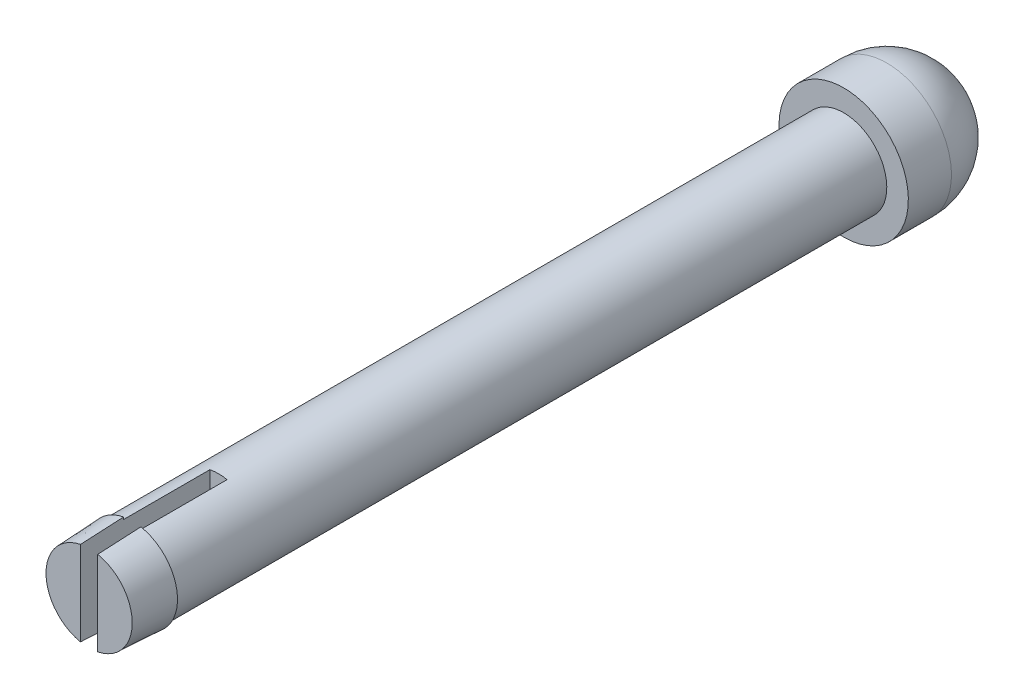
ISO-10303-21;
HEADER;
FILE_DESCRIPTION(('STEP AP214'),'2;1');
FILE_NAME('part.step','',(''),(''),'','','');
FILE_SCHEMA(('AUTOMOTIVE_DESIGN { 1 0 10303 214 1 1 1 1 }'));
ENDSEC;
DATA;
#1=APPLICATION_CONTEXT('core data for automotive mechanical design processes');
#2=APPLICATION_PROTOCOL_DEFINITION('international standard','automotive_design',2000,#1);
#3=PRODUCT_CONTEXT('',#1,'mechanical');
#4=PRODUCT('Part','Part','',(#3));
#5=PRODUCT_RELATED_PRODUCT_CATEGORY('part','',(#4));
#6=PRODUCT_DEFINITION_FORMATION('','',#4);
#7=PRODUCT_DEFINITION_CONTEXT('part definition',#1,'design');
#8=PRODUCT_DEFINITION('design','',#6,#7);
#9=PRODUCT_DEFINITION_SHAPE('','',#8);
#10=(LENGTH_UNIT() NAMED_UNIT(*) SI_UNIT(.MILLI.,.METRE.));
#11=(NAMED_UNIT(*) PLANE_ANGLE_UNIT() SI_UNIT($,.RADIAN.));
#12=(NAMED_UNIT(*) SI_UNIT($,.STERADIAN.) SOLID_ANGLE_UNIT());
#13=UNCERTAINTY_MEASURE_WITH_UNIT(LENGTH_MEASURE(1.E-05),#10,'distance_accuracy_value','');
#14=(GEOMETRIC_REPRESENTATION_CONTEXT(3) GLOBAL_UNCERTAINTY_ASSIGNED_CONTEXT((#13)) GLOBAL_UNIT_ASSIGNED_CONTEXT((#10,
#11,#12)) REPRESENTATION_CONTEXT('',''));
#15=CARTESIAN_POINT('',(0.,0.,0.));
#16=DIRECTION('',(0.,0.,1.));
#17=DIRECTION('',(1.,0.,0.));
#18=AXIS2_PLACEMENT_3D('',#15,#16,#17);
#19=CARTESIAN_POINT('',(0.,0.,-2.));
#20=DIRECTION('',(0.,0.,-1.));
#21=DIRECTION('',(0.,1.,0.));
#22=AXIS2_PLACEMENT_3D('',#19,#20,#21);
#23=CONICAL_SURFACE('',#22,2.1,0.0499583957219431);
#24=CARTESIAN_POINT('',(-0.4,-1.83335675770293,2.47029442686772));
#25=CARTESIAN_POINT('',(-0.4,-1.90062712184205,1.15527599281112));
#26=CARTESIAN_POINT('',(-0.4,-1.96777342505117,-0.159748764169583));
#27=CARTESIAN_POINT('',(-0.4,-2.10181790949153,-2.78981092166637));
#28=CARTESIAN_POINT('',(-0.4,-2.16871609072321,-4.10484832218244));
#29=CARTESIAN_POINT('',(-0.4,-2.23549021102532,-5.41989204562258));
#30=B_SPLINE_CURVE_WITH_KNOTS('',3,(#24,#25,#26,#27,#28,#29),.UNSPECIFIED.,.F.,.F.,(4,2,4),(0.,
3.95021374580684,7.90042748466622),.UNSPECIFIED.);
#31=CARTESIAN_POINT('',(-0.4,-1.95959179422654,0.));
#32=VERTEX_POINT('',#31);
#33=CARTESIAN_POINT('',(-0.4,-2.06155281280883,-2.));
#34=VERTEX_POINT('',#33);
#35=EDGE_CURVE('E193',#32,#34,#30,.T.);
#36=ORIENTED_EDGE('',*,*,#35,.F.);
#37=CARTESIAN_POINT('',(0.,0.,0.));
#38=DIRECTION('',(0.,0.,-1.));
#39=DIRECTION('',(0.,1.,0.));
#40=AXIS2_PLACEMENT_3D('',#37,#38,#39);
#41=CIRCLE('',#40,2.);
#42=CARTESIAN_POINT('',(-0.4,1.95959179422654,0.));
#43=VERTEX_POINT('',#42);
#44=EDGE_CURVE('E118',#32,#43,#41,.T.);
#45=ORIENTED_EDGE('',*,*,#44,.T.);
#46=CARTESIAN_POINT('',(-0.4,2.23549021102532,-5.41989204562258));
#47=CARTESIAN_POINT('',(-0.4,2.16871609072321,-4.10484832218244));
#48=CARTESIAN_POINT('',(-0.4,2.10181790949153,-2.78981092166637));
#49=CARTESIAN_POINT('',(-0.4,1.96777342505117,-0.159748764169584));
#50=CARTESIAN_POINT('',(-0.4,1.90062712184205,1.15527599281112));
#51=CARTESIAN_POINT('',(-0.4,1.83335675770293,2.47029442686772));
#52=B_SPLINE_CURVE_WITH_KNOTS('',3,(#46,#47,#48,#49,#50,#51),.UNSPECIFIED.,.F.,.F.,(4,2,4),(0.,
3.95021373885938,7.90042748466622),.UNSPECIFIED.);
#53=CARTESIAN_POINT('',(-0.4,2.06155281280883,-2.));
#54=VERTEX_POINT('',#53);
#55=EDGE_CURVE('E188',#54,#43,#52,.T.);
#56=ORIENTED_EDGE('',*,*,#55,.F.);
#57=CARTESIAN_POINT('',(0.,0.,-2.));
#58=DIRECTION('',(0.,0.,-1.));
#59=DIRECTION('',(0.,1.,0.));
#60=AXIS2_PLACEMENT_3D('',#57,#58,#59);
#61=CIRCLE('',#60,2.1);
#62=EDGE_CURVE('E117',#34,#54,#61,.T.);
#63=ORIENTED_EDGE('',*,*,#62,.F.);
#64=EDGE_LOOP('',(#36,#45,#56,#63));
#65=FACE_BOUND('',#64,.T.);
#66=ADVANCED_FACE('F34',(#65),#23,.T.);
#67=CARTESIAN_POINT('',(0.,2.1,-2.));
#68=DIRECTION('',(0.,0.,-1.));
#69=DIRECTION('',(0.,1.,0.));
#70=AXIS2_PLACEMENT_3D('',#67,#68,#69);
#71=PLANE('',#70);
#72=DIRECTION('',(0.,1.,0.));
#73=VECTOR('',#72,1.);
#74=CARTESIAN_POINT('',(-0.4,2.1,-2.));
#75=LINE('',#74,#73);
#76=CARTESIAN_POINT('',(-0.4,-1.95959179422654,-2.));
#77=VERTEX_POINT('',#76);
#78=EDGE_CURVE('E57',#34,#77,#75,.T.);
#79=ORIENTED_EDGE('',*,*,#78,.F.);
#80=ORIENTED_EDGE('',*,*,#62,.T.);
#81=CARTESIAN_POINT('',(-0.4,1.95959179422654,-2.));
#82=VERTEX_POINT('',#81);
#83=EDGE_CURVE('E186',#82,#54,#75,.T.);
#84=ORIENTED_EDGE('',*,*,#83,.F.);
#85=CARTESIAN_POINT('',(0.,0.,-2.));
#86=DIRECTION('',(0.,0.,-1.));
#87=DIRECTION('',(0.,1.,0.));
#88=AXIS2_PLACEMENT_3D('',#85,#86,#87);
#89=CIRCLE('',#88,2.);
#90=EDGE_CURVE('E105',#82,#77,#89,.F.);
#91=ORIENTED_EDGE('',*,*,#90,.T.);
#92=EDGE_LOOP('',(#79,#80,#84,#91));
#93=FACE_BOUND('',#92,.T.);
#94=ADVANCED_FACE('F201',(#93),#71,.T.);
#95=CARTESIAN_POINT('',(0.,0.,0.));
#96=DIRECTION('',(0.,0.,1.));
#97=DIRECTION('',(1.,0.,0.));
#98=AXIS2_PLACEMENT_3D('',#95,#96,#97);
#99=PLANE('',#98);
#100=DIRECTION('',(0.,-1.,0.));
#101=VECTOR('',#100,1.);
#102=CARTESIAN_POINT('',(-0.4,0.,0.));
#103=LINE('',#102,#101);
#104=EDGE_CURVE('E104',#43,#32,#103,.T.);
#105=ORIENTED_EDGE('',*,*,#104,.F.);
#106=ORIENTED_EDGE('',*,*,#44,.F.);
#107=EDGE_LOOP('',(#105,#106));
#108=FACE_BOUND('',#107,.T.);
#109=ADVANCED_FACE('F204',(#108),#99,.T.);
#110=CARTESIAN_POINT('',(0.,0.,-36.));
#111=DIRECTION('',(0.,0.,1.));
#112=DIRECTION('',(1.,0.,0.));
#113=AXIS2_PLACEMENT_3D('',#110,#111,#112);
#114=CYLINDRICAL_SURFACE('',#113,2.);
#115=DIRECTION('',(0.,0.,1.));
#116=VECTOR('',#115,1.);
#117=CARTESIAN_POINT('',(-0.4,-1.95959179422654,-36.));
#118=LINE('',#117,#116);
#119=CARTESIAN_POINT('',(-0.4,-1.95959179422654,-6.));
#120=VERTEX_POINT('',#119);
#121=EDGE_CURVE('E123',#77,#120,#118,.F.);
#122=ORIENTED_EDGE('',*,*,#121,.F.);
#123=ORIENTED_EDGE('',*,*,#90,.F.);
#124=DIRECTION('',(0.,0.,1.));
#125=VECTOR('',#124,1.);
#126=CARTESIAN_POINT('',(-0.4,1.95959179422654,-36.));
#127=LINE('',#126,#125);
#128=CARTESIAN_POINT('',(-0.4,1.95959179422654,-6.));
#129=VERTEX_POINT('',#128);
#130=EDGE_CURVE('E148',#129,#82,#127,.T.);
#131=ORIENTED_EDGE('',*,*,#130,.F.);
#132=CARTESIAN_POINT('',(0.,0.,-6.));
#133=DIRECTION('',(0.,0.,1.));
#134=DIRECTION('',(1.,0.,0.));
#135=AXIS2_PLACEMENT_3D('',#132,#133,#134);
#136=CIRCLE('',#135,2.);
#137=CARTESIAN_POINT('',(0.4,1.95959179422654,-6.));
#138=VERTEX_POINT('',#137);
#139=EDGE_CURVE('E38',#129,#138,#136,.F.);
#140=ORIENTED_EDGE('',*,*,#139,.T.);
#141=DIRECTION('',(0.,0.,1.));
#142=VECTOR('',#141,1.);
#143=CARTESIAN_POINT('',(0.4,1.95959179422654,-36.));
#144=LINE('',#143,#142);
#145=CARTESIAN_POINT('',(0.4,1.95959179422654,-2.));
#146=VERTEX_POINT('',#145);
#147=EDGE_CURVE('E113',#146,#138,#144,.F.);
#148=ORIENTED_EDGE('',*,*,#147,.F.);
#149=CARTESIAN_POINT('',(0.4,-1.95959179422654,-2.));
#150=VERTEX_POINT('',#149);
#151=EDGE_CURVE('E136',#150,#146,#89,.F.);
#152=ORIENTED_EDGE('',*,*,#151,.F.);
#153=DIRECTION('',(0.,0.,1.));
#154=VECTOR('',#153,1.);
#155=CARTESIAN_POINT('',(0.4,-1.95959179422654,-36.));
#156=LINE('',#155,#154);
#157=CARTESIAN_POINT('',(0.4,-1.95959179422654,-6.));
#158=VERTEX_POINT('',#157);
#159=EDGE_CURVE('E170',#158,#150,#156,.T.);
#160=ORIENTED_EDGE('',*,*,#159,.F.);
#161=EDGE_CURVE('E11',#158,#120,#136,.F.);
#162=ORIENTED_EDGE('',*,*,#161,.T.);
#163=EDGE_LOOP('',(#122,#123,#131,#140,#148,#152,#160,#162));
#164=FACE_BOUND('',#163,.T.);
#165=CARTESIAN_POINT('',(0.,0.,-35.));
#166=DIRECTION('',(0.,0.,1.));
#167=DIRECTION('',(0.,-1.,0.));
#168=AXIS2_PLACEMENT_3D('',#165,#166,#167);
#169=CIRCLE('',#168,2.);
#170=CARTESIAN_POINT('',(0.,-2.,-35.));
#171=VERTEX_POINT('',#170);
#172=EDGE_CURVE('E133',#171,#171,#169,.F.);
#173=ORIENTED_EDGE('',*,*,#172,.F.);
#174=EDGE_LOOP('',(#173));
#175=FACE_BOUND('',#174,.T.);
#176=ADVANCED_FACE('F36',(#164,#175),#114,.T.);
#177=CARTESIAN_POINT('',(0.,-3.,-35.));
#178=DIRECTION('',(0.,0.,1.));
#179=DIRECTION('',(0.,-1.,0.));
#180=AXIS2_PLACEMENT_3D('',#177,#178,#179);
#181=PLANE('',#180);
#182=ORIENTED_EDGE('',*,*,#172,.T.);
#183=EDGE_LOOP('',(#182));
#184=FACE_BOUND('',#183,.T.);
#185=CARTESIAN_POINT('',(0.,0.,-35.));
#186=DIRECTION('',(0.,0.,1.));
#187=DIRECTION('',(0.,-1.,0.));
#188=AXIS2_PLACEMENT_3D('',#185,#186,#187);
#189=CIRCLE('',#188,3.);
#190=CARTESIAN_POINT('',(0.,-3.,-35.));
#191=VERTEX_POINT('',#190);
#192=EDGE_CURVE('E130',#191,#191,#189,.T.);
#193=ORIENTED_EDGE('',*,*,#192,.T.);
#194=EDGE_LOOP('',(#193));
#195=FACE_BOUND('',#194,.T.);
#196=ADVANCED_FACE('F210',(#184,#195),#181,.T.);
#197=CARTESIAN_POINT('',(0.,0.,-35.));
#198=DIRECTION('',(0.,0.,1.));
#199=DIRECTION('',(0.,-1.,0.));
#200=AXIS2_PLACEMENT_3D('',#197,#198,#199);
#201=CYLINDRICAL_SURFACE('',#200,3.);
#202=CARTESIAN_POINT('',(0.,0.,-37.));
#203=DIRECTION('',(0.,0.,1.));
#204=DIRECTION('',(0.,-1.,0.));
#205=AXIS2_PLACEMENT_3D('',#202,#203,#204);
#206=CIRCLE('',#205,3.);
#207=CARTESIAN_POINT('',(0.,-3.,-37.));
#208=VERTEX_POINT('',#207);
#209=EDGE_CURVE('E127',#208,#208,#206,.T.);
#210=ORIENTED_EDGE('',*,*,#209,.T.);
#211=EDGE_LOOP('',(#210));
#212=FACE_BOUND('',#211,.T.);
#213=ORIENTED_EDGE('',*,*,#192,.F.);
#214=EDGE_LOOP('',(#213));
#215=FACE_BOUND('',#214,.T.);
#216=ADVANCED_FACE('F223',(#212,#215),#201,.T.);
#217=CARTESIAN_POINT('',(0.,0.,-37.));
#218=DIRECTION('',(0.,0.,1.));
#219=DIRECTION('',(0.,-1.,0.));
#220=AXIS2_PLACEMENT_3D('',#217,#218,#219);
#221=SPHERICAL_SURFACE('',#220,3.);
#222=ORIENTED_EDGE('',*,*,#209,.F.);
#223=EDGE_LOOP('',(#222));
#224=FACE_BOUND('',#223,.T.);
#225=ADVANCED_FACE('F217',(#224),#221,.T.);
#226=CARTESIAN_POINT('',(0.4,-2.23549021102532,-5.41989204562258));
#227=CARTESIAN_POINT('',(0.4,-2.16871609072321,-4.10484832218244));
#228=CARTESIAN_POINT('',(0.4,-2.10181790949153,-2.78981092166637));
#229=CARTESIAN_POINT('',(0.4,-1.96777342505117,-0.159748764169584));
#230=CARTESIAN_POINT('',(0.4,-1.90062712184205,1.15527599281112));
#231=CARTESIAN_POINT('',(0.4,-1.83335675770293,2.47029442686772));
#232=B_SPLINE_CURVE_WITH_KNOTS('',3,(#226,#227,#228,#229,#230,#231),.UNSPECIFIED.,.F.,.F.,(4,2,
4),(0.,3.95021373885938,7.90042748466622),.UNSPECIFIED.);
#233=CARTESIAN_POINT('',(0.4,-2.06155281280883,-2.));
#234=VERTEX_POINT('',#233);
#235=CARTESIAN_POINT('',(0.4,-1.95959179422654,0.));
#236=VERTEX_POINT('',#235);
#237=EDGE_CURVE('E49',#234,#236,#232,.T.);
#238=ORIENTED_EDGE('',*,*,#237,.F.);
#239=CARTESIAN_POINT('',(0.4,2.06155281280883,-2.));
#240=VERTEX_POINT('',#239);
#241=EDGE_CURVE('E112',#240,#234,#61,.T.);
#242=ORIENTED_EDGE('',*,*,#241,.F.);
#243=CARTESIAN_POINT('',(0.4,1.83335675770293,2.47029442686772));
#244=CARTESIAN_POINT('',(0.4,1.90062712184205,1.15527599281112));
#245=CARTESIAN_POINT('',(0.4,1.96777342505117,-0.159748764169583));
#246=CARTESIAN_POINT('',(0.4,2.10181790949153,-2.78981092166637));
#247=CARTESIAN_POINT('',(0.4,2.16871609072321,-4.10484832218244));
#248=CARTESIAN_POINT('',(0.4,2.23549021102532,-5.41989204562258));
#249=B_SPLINE_CURVE_WITH_KNOTS('',3,(#243,#244,#245,#246,#247,#248),.UNSPECIFIED.,.F.,.F.,(4,2,
4),(0.,3.95021374580684,7.90042748466622),.UNSPECIFIED.);
#250=CARTESIAN_POINT('',(0.4,1.95959179422654,0.));
#251=VERTEX_POINT('',#250);
#252=EDGE_CURVE('E99',#251,#240,#249,.T.);
#253=ORIENTED_EDGE('',*,*,#252,.F.);
#254=EDGE_CURVE('E110',#251,#236,#41,.T.);
#255=ORIENTED_EDGE('',*,*,#254,.T.);
#256=EDGE_LOOP('',(#238,#242,#253,#255));
#257=FACE_BOUND('',#256,.T.);
#258=ADVANCED_FACE('F109',(#257),#23,.T.);
#259=DIRECTION('',(0.,-1.,0.));
#260=VECTOR('',#259,1.);
#261=CARTESIAN_POINT('',(0.4,2.1,-2.));
#262=LINE('',#261,#260);
#263=EDGE_CURVE('E114',#240,#146,#262,.T.);
#264=ORIENTED_EDGE('',*,*,#263,.F.);
#265=ORIENTED_EDGE('',*,*,#241,.T.);
#266=EDGE_CURVE('E159',#150,#234,#262,.T.);
#267=ORIENTED_EDGE('',*,*,#266,.F.);
#268=ORIENTED_EDGE('',*,*,#151,.T.);
#269=EDGE_LOOP('',(#264,#265,#267,#268));
#270=FACE_BOUND('',#269,.T.);
#271=ADVANCED_FACE('F179',(#270),#71,.T.);
#272=DIRECTION('',(0.,1.,0.));
#273=VECTOR('',#272,1.);
#274=CARTESIAN_POINT('',(0.4,0.,0.));
#275=LINE('',#274,#273);
#276=EDGE_CURVE('E96',#236,#251,#275,.T.);
#277=ORIENTED_EDGE('',*,*,#276,.F.);
#278=ORIENTED_EDGE('',*,*,#254,.F.);
#279=EDGE_LOOP('',(#277,#278));
#280=FACE_BOUND('',#279,.T.);
#281=ADVANCED_FACE('F116',(#280),#99,.T.);
#282=CARTESIAN_POINT('',(-0.4,-2.06155281280883,-6.));
#283=DIRECTION('',(-1.,0.,0.));
#284=DIRECTION('',(0.,0.,1.));
#285=AXIS2_PLACEMENT_3D('',#282,#283,#284);
#286=PLANE('',#285);
#287=ORIENTED_EDGE('',*,*,#121,.T.);
#288=DIRECTION('',(0.,-1.,0.));
#289=VECTOR('',#288,1.);
#290=CARTESIAN_POINT('',(-0.4,-2.06155281280883,-6.));
#291=LINE('',#290,#289);
#292=EDGE_CURVE('E154',#129,#120,#291,.T.);
#293=ORIENTED_EDGE('',*,*,#292,.F.);
#294=ORIENTED_EDGE('',*,*,#130,.T.);
#295=ORIENTED_EDGE('',*,*,#83,.T.);
#296=ORIENTED_EDGE('',*,*,#55,.T.);
#297=ORIENTED_EDGE('',*,*,#104,.T.);
#298=ORIENTED_EDGE('',*,*,#35,.T.);
#299=ORIENTED_EDGE('',*,*,#78,.T.);
#300=EDGE_LOOP('',(#287,#293,#294,#295,#296,#297,#298,#299));
#301=FACE_BOUND('',#300,.T.);
#302=ADVANCED_FACE('F157',(#301),#286,.F.);
#303=CARTESIAN_POINT('',(0.4,-2.06155281280883,-6.));
#304=DIRECTION('',(1.,0.,0.));
#305=DIRECTION('',(0.,0.,-1.));
#306=AXIS2_PLACEMENT_3D('',#303,#304,#305);
#307=PLANE('',#306);
#308=ORIENTED_EDGE('',*,*,#147,.T.);
#309=DIRECTION('',(0.,1.,0.));
#310=VECTOR('',#309,1.);
#311=CARTESIAN_POINT('',(0.4,-2.06155281280883,-6.));
#312=LINE('',#311,#310);
#313=EDGE_CURVE('E156',#158,#138,#312,.T.);
#314=ORIENTED_EDGE('',*,*,#313,.F.);
#315=ORIENTED_EDGE('',*,*,#159,.T.);
#316=ORIENTED_EDGE('',*,*,#266,.T.);
#317=ORIENTED_EDGE('',*,*,#237,.T.);
#318=ORIENTED_EDGE('',*,*,#276,.T.);
#319=ORIENTED_EDGE('',*,*,#252,.T.);
#320=ORIENTED_EDGE('',*,*,#263,.T.);
#321=EDGE_LOOP('',(#308,#314,#315,#316,#317,#318,#319,#320));
#322=FACE_BOUND('',#321,.T.);
#323=ADVANCED_FACE('F98',(#322),#307,.F.);
#324=CARTESIAN_POINT('',(0.,0.,-6.));
#325=DIRECTION('',(0.,0.,1.));
#326=DIRECTION('',(1.,0.,0.));
#327=AXIS2_PLACEMENT_3D('',#324,#325,#326);
#328=PLANE('',#327);
#329=ORIENTED_EDGE('',*,*,#313,.T.);
#330=ORIENTED_EDGE('',*,*,#139,.F.);
#331=ORIENTED_EDGE('',*,*,#292,.T.);
#332=ORIENTED_EDGE('',*,*,#161,.F.);
#333=EDGE_LOOP('',(#329,#330,#331,#332));
#334=FACE_BOUND('',#333,.T.);
#335=ADVANCED_FACE('F153',(#334),#328,.T.);
#336=CLOSED_SHELL('',(#66,#94,#109,#176,#196,#216,#225,#258,#271,#281,#302,#323,#335));
#337=MANIFOLD_SOLID_BREP('B2',#336);
#338=ADVANCED_BREP_SHAPE_REPRESENTATION('',(#18,#337),#14);
#339=SHAPE_DEFINITION_REPRESENTATION(#9,#338);
ENDSEC;
END-ISO-10303-21;
